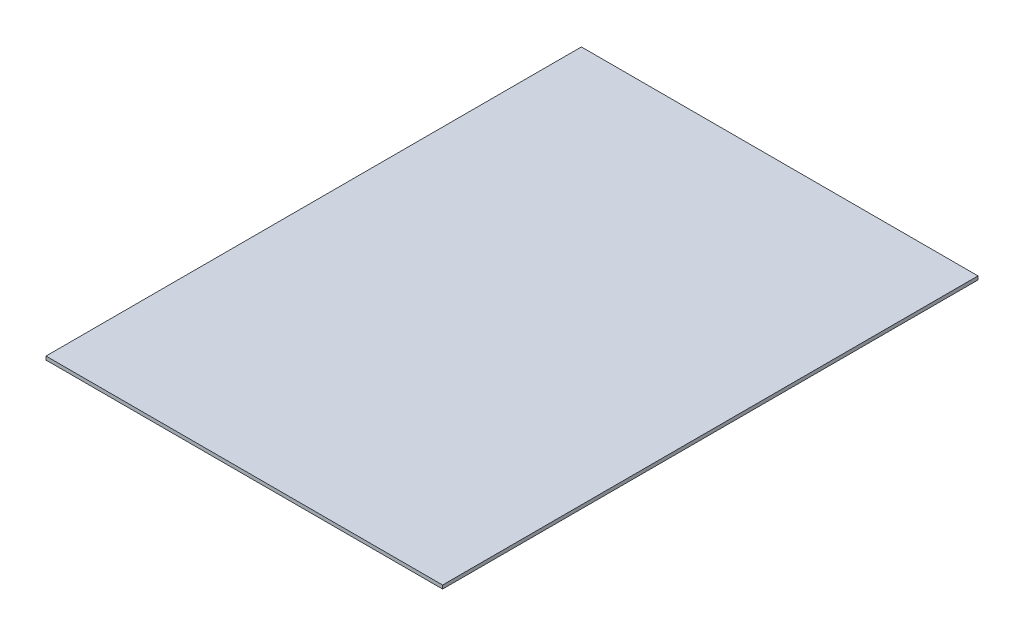
ISO-10303-21;
HEADER;
FILE_DESCRIPTION(('STEP AP214'),'2;1');
FILE_NAME('part.step','',(''),(''),'','','');
FILE_SCHEMA(('AUTOMOTIVE_DESIGN { 1 0 10303 214 1 1 1 1 }'));
ENDSEC;
DATA;
#1=APPLICATION_CONTEXT('core data for automotive mechanical design processes');
#2=APPLICATION_PROTOCOL_DEFINITION('international standard','automotive_design',2000,#1);
#3=PRODUCT_CONTEXT('',#1,'mechanical');
#4=PRODUCT('Part','Part','',(#3));
#5=PRODUCT_RELATED_PRODUCT_CATEGORY('part','',(#4));
#6=PRODUCT_DEFINITION_FORMATION('','',#4);
#7=PRODUCT_DEFINITION_CONTEXT('part definition',#1,'design');
#8=PRODUCT_DEFINITION('design','',#6,#7);
#9=PRODUCT_DEFINITION_SHAPE('','',#8);
#10=(LENGTH_UNIT() NAMED_UNIT(*) SI_UNIT(.MILLI.,.METRE.));
#11=(NAMED_UNIT(*) PLANE_ANGLE_UNIT() SI_UNIT($,.RADIAN.));
#12=(NAMED_UNIT(*) SI_UNIT($,.STERADIAN.) SOLID_ANGLE_UNIT());
#13=UNCERTAINTY_MEASURE_WITH_UNIT(LENGTH_MEASURE(1.E-05),#10,'distance_accuracy_value','');
#14=(GEOMETRIC_REPRESENTATION_CONTEXT(3) GLOBAL_UNCERTAINTY_ASSIGNED_CONTEXT((#13)) GLOBAL_UNIT_ASSIGNED_CONTEXT((#10,
#11,#12)) REPRESENTATION_CONTEXT('',''));
#15=CARTESIAN_POINT('',(0.,0.,0.));
#16=DIRECTION('',(0.,0.,1.));
#17=DIRECTION('',(1.,0.,0.));
#18=AXIS2_PLACEMENT_3D('',#15,#16,#17);
#19=CARTESIAN_POINT('',(88.9,1.5875,-120.015));
#20=DIRECTION('',(-1.,0.,0.));
#21=DIRECTION('',(0.,0.,1.));
#22=AXIS2_PLACEMENT_3D('',#19,#20,#21);
#23=PLANE('',#22);
#24=DIRECTION('',(0.,0.,-1.));
#25=VECTOR('',#24,1.);
#26=CARTESIAN_POINT('',(88.9,0.,-120.015));
#27=LINE('',#26,#25);
#28=CARTESIAN_POINT('',(88.9,0.,120.015));
#29=VERTEX_POINT('',#28);
#30=CARTESIAN_POINT('',(88.9,0.,-120.015));
#31=VERTEX_POINT('',#30);
#32=EDGE_CURVE('E111',#29,#31,#27,.T.);
#33=ORIENTED_EDGE('',*,*,#32,.T.);
#34=DIRECTION('',(0.,-1.,0.));
#35=VECTOR('',#34,1.);
#36=CARTESIAN_POINT('',(88.9,1.5875,-120.015));
#37=LINE('',#36,#35);
#38=CARTESIAN_POINT('',(88.9,1.5875,-120.015));
#39=VERTEX_POINT('',#38);
#40=EDGE_CURVE('E11',#39,#31,#37,.T.);
#41=ORIENTED_EDGE('',*,*,#40,.F.);
#42=DIRECTION('',(0.,0.,-1.));
#43=VECTOR('',#42,1.);
#44=CARTESIAN_POINT('',(88.9,1.5875,-120.015));
#45=LINE('',#44,#43);
#46=CARTESIAN_POINT('',(88.9,1.5875,120.015));
#47=VERTEX_POINT('',#46);
#48=EDGE_CURVE('E95',#47,#39,#45,.T.);
#49=ORIENTED_EDGE('',*,*,#48,.F.);
#50=DIRECTION('',(0.,-1.,0.));
#51=VECTOR('',#50,1.);
#52=CARTESIAN_POINT('',(88.9,1.5875,120.015));
#53=LINE('',#52,#51);
#54=EDGE_CURVE('E107',#47,#29,#53,.T.);
#55=ORIENTED_EDGE('',*,*,#54,.T.);
#56=EDGE_LOOP('',(#33,#41,#49,#55));
#57=FACE_BOUND('',#56,.T.);
#58=ADVANCED_FACE('F43',(#57),#23,.F.);
#59=CARTESIAN_POINT('',(-88.9,1.5875,-120.015));
#60=DIRECTION('',(0.,0.,1.));
#61=DIRECTION('',(1.,0.,0.));
#62=AXIS2_PLACEMENT_3D('',#59,#60,#61);
#63=PLANE('',#62);
#64=DIRECTION('',(-1.,0.,0.));
#65=VECTOR('',#64,1.);
#66=CARTESIAN_POINT('',(-88.9,0.,-120.015));
#67=LINE('',#66,#65);
#68=CARTESIAN_POINT('',(-88.9,0.,-120.015));
#69=VERTEX_POINT('',#68);
#70=EDGE_CURVE('E100',#31,#69,#67,.T.);
#71=ORIENTED_EDGE('',*,*,#70,.T.);
#72=DIRECTION('',(0.,-1.,0.));
#73=VECTOR('',#72,1.);
#74=CARTESIAN_POINT('',(-88.9,1.5875,-120.015));
#75=LINE('',#74,#73);
#76=CARTESIAN_POINT('',(-88.9,1.5875,-120.015));
#77=VERTEX_POINT('',#76);
#78=EDGE_CURVE('E52',#77,#69,#75,.T.);
#79=ORIENTED_EDGE('',*,*,#78,.F.);
#80=DIRECTION('',(-1.,0.,0.));
#81=VECTOR('',#80,1.);
#82=CARTESIAN_POINT('',(-88.9,1.5875,-120.015));
#83=LINE('',#82,#81);
#84=EDGE_CURVE('E90',#39,#77,#83,.T.);
#85=ORIENTED_EDGE('',*,*,#84,.F.);
#86=ORIENTED_EDGE('',*,*,#40,.T.);
#87=EDGE_LOOP('',(#71,#79,#85,#86));
#88=FACE_BOUND('',#87,.T.);
#89=ADVANCED_FACE('F99',(#88),#63,.F.);
#90=CARTESIAN_POINT('',(-88.9,1.5875,-120.015));
#91=DIRECTION('',(1.,0.,0.));
#92=DIRECTION('',(0.,0.,-1.));
#93=AXIS2_PLACEMENT_3D('',#90,#91,#92);
#94=PLANE('',#93);
#95=DIRECTION('',(0.,0.,1.));
#96=VECTOR('',#95,1.);
#97=CARTESIAN_POINT('',(-88.9,0.,-120.015));
#98=LINE('',#97,#96);
#99=CARTESIAN_POINT('',(-88.9,0.,120.015));
#100=VERTEX_POINT('',#99);
#101=EDGE_CURVE('E77',#69,#100,#98,.T.);
#102=ORIENTED_EDGE('',*,*,#101,.T.);
#103=DIRECTION('',(0.,-1.,0.));
#104=VECTOR('',#103,1.);
#105=CARTESIAN_POINT('',(-88.9,1.5875,120.015));
#106=LINE('',#105,#104);
#107=CARTESIAN_POINT('',(-88.9,1.5875,120.015));
#108=VERTEX_POINT('',#107);
#109=EDGE_CURVE('E102',#108,#100,#106,.T.);
#110=ORIENTED_EDGE('',*,*,#109,.F.);
#111=DIRECTION('',(0.,0.,1.));
#112=VECTOR('',#111,1.);
#113=CARTESIAN_POINT('',(-88.9,1.5875,-120.015));
#114=LINE('',#113,#112);
#115=EDGE_CURVE('E93',#77,#108,#114,.T.);
#116=ORIENTED_EDGE('',*,*,#115,.F.);
#117=ORIENTED_EDGE('',*,*,#78,.T.);
#118=EDGE_LOOP('',(#102,#110,#116,#117));
#119=FACE_BOUND('',#118,.T.);
#120=ADVANCED_FACE('F103',(#119),#94,.F.);
#121=CARTESIAN_POINT('',(-88.9,1.5875,120.015));
#122=DIRECTION('',(0.,0.,-1.));
#123=DIRECTION('',(-1.,0.,0.));
#124=AXIS2_PLACEMENT_3D('',#121,#122,#123);
#125=PLANE('',#124);
#126=DIRECTION('',(1.,0.,0.));
#127=VECTOR('',#126,1.);
#128=CARTESIAN_POINT('',(-88.9,0.,120.015));
#129=LINE('',#128,#127);
#130=EDGE_CURVE('E83',#100,#29,#129,.T.);
#131=ORIENTED_EDGE('',*,*,#130,.T.);
#132=ORIENTED_EDGE('',*,*,#54,.F.);
#133=DIRECTION('',(1.,0.,0.));
#134=VECTOR('',#133,1.);
#135=CARTESIAN_POINT('',(-88.9,1.5875,120.015));
#136=LINE('',#135,#134);
#137=EDGE_CURVE('E60',#108,#47,#136,.T.);
#138=ORIENTED_EDGE('',*,*,#137,.F.);
#139=ORIENTED_EDGE('',*,*,#109,.T.);
#140=EDGE_LOOP('',(#131,#132,#138,#139));
#141=FACE_BOUND('',#140,.T.);
#142=ADVANCED_FACE('F124',(#141),#125,.F.);
#143=CARTESIAN_POINT('',(0.,1.5875,0.));
#144=DIRECTION('',(0.,1.,0.));
#145=DIRECTION('',(0.,0.,1.));
#146=AXIS2_PLACEMENT_3D('',#143,#144,#145);
#147=PLANE('',#146);
#148=ORIENTED_EDGE('',*,*,#48,.T.);
#149=ORIENTED_EDGE('',*,*,#84,.T.);
#150=ORIENTED_EDGE('',*,*,#115,.T.);
#151=ORIENTED_EDGE('',*,*,#137,.T.);
#152=EDGE_LOOP('',(#148,#149,#150,#151));
#153=FACE_BOUND('',#152,.T.);
#154=ADVANCED_FACE('F91',(#153),#147,.T.);
#155=CARTESIAN_POINT('',(0.,0.,0.));
#156=DIRECTION('',(0.,1.,0.));
#157=DIRECTION('',(0.,0.,1.));
#158=AXIS2_PLACEMENT_3D('',#155,#156,#157);
#159=PLANE('',#158);
#160=ORIENTED_EDGE('',*,*,#32,.F.);
#161=ORIENTED_EDGE('',*,*,#130,.F.);
#162=ORIENTED_EDGE('',*,*,#101,.F.);
#163=ORIENTED_EDGE('',*,*,#70,.F.);
#164=EDGE_LOOP('',(#160,#161,#162,#163));
#165=FACE_BOUND('',#164,.T.);
#166=ADVANCED_FACE('F127',(#165),#159,.F.);
#167=CLOSED_SHELL('',(#58,#89,#120,#142,#154,#166));
#168=MANIFOLD_SOLID_BREP('B2',#167);
#169=ADVANCED_BREP_SHAPE_REPRESENTATION('',(#18,#168),#14);
#170=SHAPE_DEFINITION_REPRESENTATION(#9,#169);
ENDSEC;
END-ISO-10303-21;
